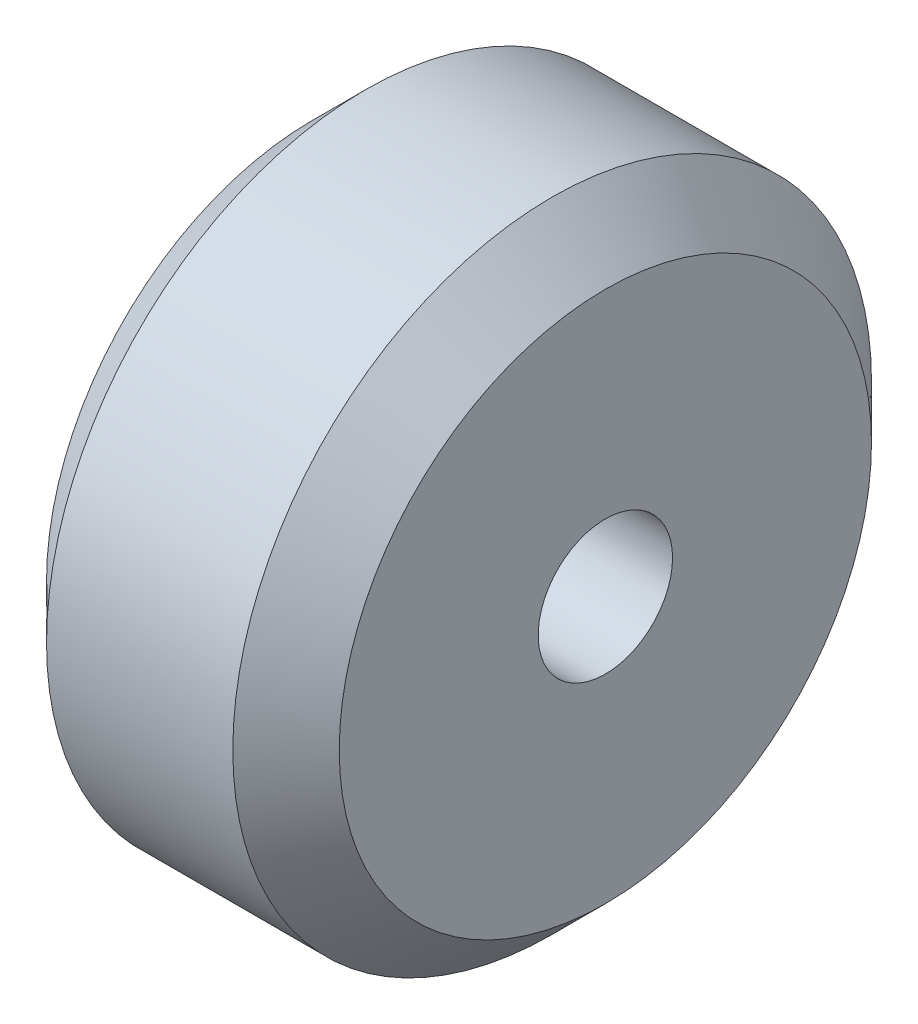
ISO-10303-21;
HEADER;
FILE_DESCRIPTION(('STEP AP214'),'2;1');
FILE_NAME('part.step','',(''),(''),'','','');
FILE_SCHEMA(('AUTOMOTIVE_DESIGN { 1 0 10303 214 1 1 1 1 }'));
ENDSEC;
DATA;
#1=APPLICATION_CONTEXT('core data for automotive mechanical design processes');
#2=APPLICATION_PROTOCOL_DEFINITION('international standard','automotive_design',2000,#1);
#3=PRODUCT_CONTEXT('',#1,'mechanical');
#4=PRODUCT('Part','Part','',(#3));
#5=PRODUCT_RELATED_PRODUCT_CATEGORY('part','',(#4));
#6=PRODUCT_DEFINITION_FORMATION('','',#4);
#7=PRODUCT_DEFINITION_CONTEXT('part definition',#1,'design');
#8=PRODUCT_DEFINITION('design','',#6,#7);
#9=PRODUCT_DEFINITION_SHAPE('','',#8);
#10=(LENGTH_UNIT() NAMED_UNIT(*) SI_UNIT(.MILLI.,.METRE.));
#11=(NAMED_UNIT(*) PLANE_ANGLE_UNIT() SI_UNIT($,.RADIAN.));
#12=(NAMED_UNIT(*) SI_UNIT($,.STERADIAN.) SOLID_ANGLE_UNIT());
#13=UNCERTAINTY_MEASURE_WITH_UNIT(LENGTH_MEASURE(1.E-05),#10,'distance_accuracy_value','');
#14=(GEOMETRIC_REPRESENTATION_CONTEXT(3) GLOBAL_UNCERTAINTY_ASSIGNED_CONTEXT((#13)) GLOBAL_UNIT_ASSIGNED_CONTEXT((#10,
#11,#12)) REPRESENTATION_CONTEXT('',''));
#15=CARTESIAN_POINT('',(0.,0.,0.));
#16=DIRECTION('',(0.,0.,1.));
#17=DIRECTION('',(1.,0.,0.));
#18=AXIS2_PLACEMENT_3D('',#15,#16,#17);
#19=CARTESIAN_POINT('',(11.,0.,0.));
#20=DIRECTION('',(1.,0.,0.));
#21=DIRECTION('',(0.,0.,-1.));
#22=AXIS2_PLACEMENT_3D('',#19,#20,#21);
#23=PLANE('',#22);
#24=CARTESIAN_POINT('',(11.,0.,0.));
#25=DIRECTION('',(1.,0.,0.));
#26=DIRECTION('',(0.,0.,-1.));
#27=AXIS2_PLACEMENT_3D('',#24,#25,#26);
#28=CIRCLE('',#27,10.);
#29=CARTESIAN_POINT('',(11.,0.,-10.));
#30=VERTEX_POINT('',#29);
#31=EDGE_CURVE('E10',#30,#30,#28,.T.);
#32=ORIENTED_EDGE('',*,*,#31,.T.);
#33=EDGE_LOOP('',(#32));
#34=FACE_BOUND('',#33,.T.);
#35=CARTESIAN_POINT('',(11.,0.,0.));
#36=DIRECTION('',(1.,0.,0.));
#37=DIRECTION('',(0.,0.,-1.));
#38=AXIS2_PLACEMENT_3D('',#35,#36,#37);
#39=CIRCLE('',#38,2.525);
#40=CARTESIAN_POINT('',(11.,0.,-2.525));
#41=VERTEX_POINT('',#40);
#42=EDGE_CURVE('E53',#41,#41,#39,.T.);
#43=ORIENTED_EDGE('',*,*,#42,.F.);
#44=EDGE_LOOP('',(#43));
#45=FACE_BOUND('',#44,.T.);
#46=ADVANCED_FACE('F32',(#34,#45),#23,.T.);
#47=CARTESIAN_POINT('',(0.,0.,0.));
#48=DIRECTION('',(1.,0.,0.));
#49=DIRECTION('',(0.,0.,-1.));
#50=AXIS2_PLACEMENT_3D('',#47,#48,#49);
#51=PLANE('',#50);
#52=CARTESIAN_POINT('',(0.,0.,0.));
#53=DIRECTION('',(1.,0.,0.));
#54=DIRECTION('',(0.,0.,-1.));
#55=AXIS2_PLACEMENT_3D('',#52,#53,#54);
#56=CIRCLE('',#55,9.99999999999999);
#57=CARTESIAN_POINT('',(0.,0.,-9.99999999999999));
#58=VERTEX_POINT('',#57);
#59=EDGE_CURVE('E40',#58,#58,#56,.F.);
#60=ORIENTED_EDGE('',*,*,#59,.T.);
#61=EDGE_LOOP('',(#60));
#62=FACE_BOUND('',#61,.T.);
#63=CARTESIAN_POINT('',(0.,0.,0.));
#64=DIRECTION('',(1.,0.,0.));
#65=DIRECTION('',(0.,0.,-1.));
#66=AXIS2_PLACEMENT_3D('',#63,#64,#65);
#67=CIRCLE('',#66,2.525);
#68=CARTESIAN_POINT('',(0.,0.,-2.525));
#69=VERTEX_POINT('',#68);
#70=EDGE_CURVE('E54',#69,#69,#67,.T.);
#71=ORIENTED_EDGE('',*,*,#70,.T.);
#72=EDGE_LOOP('',(#71));
#73=FACE_BOUND('',#72,.T.);
#74=ADVANCED_FACE('F64',(#62,#73),#51,.F.);
#75=CARTESIAN_POINT('',(11.,0.,0.));
#76=DIRECTION('',(-1.,0.,0.));
#77=DIRECTION('',(0.,0.,1.));
#78=AXIS2_PLACEMENT_3D('',#75,#76,#77);
#79=CYLINDRICAL_SURFACE('',#78,12.);
#80=CARTESIAN_POINT('',(2.,0.,0.));
#81=DIRECTION('',(1.,0.,0.));
#82=DIRECTION('',(0.,0.,-1.));
#83=AXIS2_PLACEMENT_3D('',#80,#81,#82);
#84=CIRCLE('',#83,12.);
#85=CARTESIAN_POINT('',(2.,0.,-12.));
#86=VERTEX_POINT('',#85);
#87=EDGE_CURVE('E44',#86,#86,#84,.T.);
#88=ORIENTED_EDGE('',*,*,#87,.T.);
#89=EDGE_LOOP('',(#88));
#90=FACE_BOUND('',#89,.T.);
#91=CARTESIAN_POINT('',(8.99999999999999,0.,0.));
#92=DIRECTION('',(1.,0.,0.));
#93=DIRECTION('',(0.,0.,-1.));
#94=AXIS2_PLACEMENT_3D('',#91,#92,#93);
#95=CIRCLE('',#94,12.);
#96=CARTESIAN_POINT('',(8.99999999999999,0.,-12.));
#97=VERTEX_POINT('',#96);
#98=EDGE_CURVE('E48',#97,#97,#95,.F.);
#99=ORIENTED_EDGE('',*,*,#98,.T.);
#100=EDGE_LOOP('',(#99));
#101=FACE_BOUND('',#100,.T.);
#102=ADVANCED_FACE('F69',(#90,#101),#79,.T.);
#103=CARTESIAN_POINT('',(11.,0.,0.));
#104=DIRECTION('',(-1.,0.,0.));
#105=DIRECTION('',(0.,0.,1.));
#106=AXIS2_PLACEMENT_3D('',#103,#104,#105);
#107=CYLINDRICAL_SURFACE('',#106,2.525);
#108=ORIENTED_EDGE('',*,*,#42,.T.);
#109=EDGE_LOOP('',(#108));
#110=FACE_BOUND('',#109,.T.);
#111=ORIENTED_EDGE('',*,*,#70,.F.);
#112=EDGE_LOOP('',(#111));
#113=FACE_BOUND('',#112,.T.);
#114=ADVANCED_FACE('F60',(#110,#113),#107,.F.);
#115=CARTESIAN_POINT('',(2.,0.,0.));
#116=DIRECTION('',(1.,0.,0.));
#117=DIRECTION('',(0.,0.,-1.));
#118=AXIS2_PLACEMENT_3D('',#115,#116,#117);
#119=CONICAL_SURFACE('',#118,12.,0.78539816339745);
#120=ORIENTED_EDGE('',*,*,#59,.F.);
#121=EDGE_LOOP('',(#120));
#122=FACE_BOUND('',#121,.T.);
#123=ORIENTED_EDGE('',*,*,#87,.F.);
#124=EDGE_LOOP('',(#123));
#125=FACE_BOUND('',#124,.T.);
#126=ADVANCED_FACE('F76',(#122,#125),#119,.T.);
#127=CARTESIAN_POINT('',(11.,0.,0.));
#128=DIRECTION('',(-1.,0.,0.));
#129=DIRECTION('',(0.,0.,1.));
#130=AXIS2_PLACEMENT_3D('',#127,#128,#129);
#131=CONICAL_SURFACE('',#130,10.,0.785398163397445);
#132=ORIENTED_EDGE('',*,*,#98,.F.);
#133=EDGE_LOOP('',(#132));
#134=FACE_BOUND('',#133,.T.);
#135=ORIENTED_EDGE('',*,*,#31,.F.);
#136=EDGE_LOOP('',(#135));
#137=FACE_BOUND('',#136,.T.);
#138=ADVANCED_FACE('F35',(#134,#137),#131,.T.);
#139=CLOSED_SHELL('',(#46,#74,#102,#114,#126,#138));
#140=MANIFOLD_SOLID_BREP('B2',#139);
#141=ADVANCED_BREP_SHAPE_REPRESENTATION('',(#18,#140),#14);
#142=SHAPE_DEFINITION_REPRESENTATION(#9,#141);
ENDSEC;
END-ISO-10303-21;
